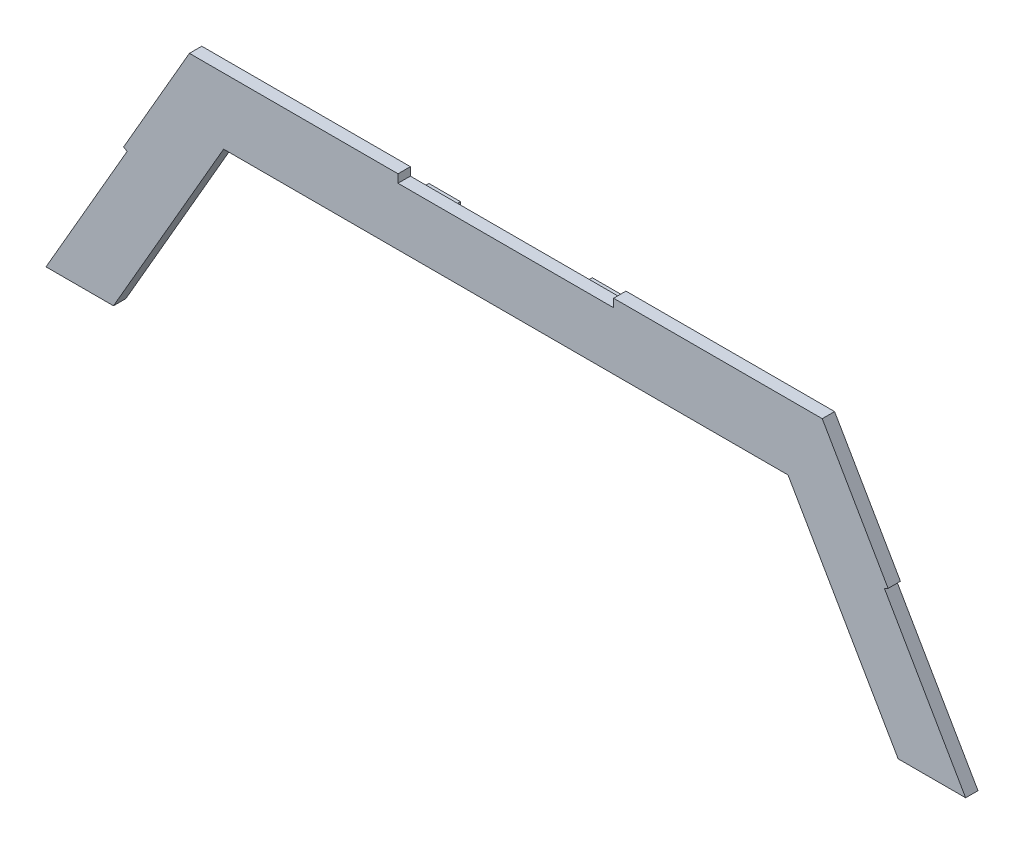
ISO-10303-21;
HEADER;
FILE_DESCRIPTION(('STEP AP214'),'2;1');
FILE_NAME('part.step','',(''),(''),'','','');
FILE_SCHEMA(('AUTOMOTIVE_DESIGN { 1 0 10303 214 1 1 1 1 }'));
ENDSEC;
DATA;
#1=APPLICATION_CONTEXT('core data for automotive mechanical design processes');
#2=APPLICATION_PROTOCOL_DEFINITION('international standard','automotive_design',2000,#1);
#3=PRODUCT_CONTEXT('',#1,'mechanical');
#4=PRODUCT('Part','Part','',(#3));
#5=PRODUCT_RELATED_PRODUCT_CATEGORY('part','',(#4));
#6=PRODUCT_DEFINITION_FORMATION('','',#4);
#7=PRODUCT_DEFINITION_CONTEXT('part definition',#1,'design');
#8=PRODUCT_DEFINITION('design','',#6,#7);
#9=PRODUCT_DEFINITION_SHAPE('','',#8);
#10=(LENGTH_UNIT() NAMED_UNIT(*) SI_UNIT(.MILLI.,.METRE.));
#11=(NAMED_UNIT(*) PLANE_ANGLE_UNIT() SI_UNIT($,.RADIAN.));
#12=(NAMED_UNIT(*) SI_UNIT($,.STERADIAN.) SOLID_ANGLE_UNIT());
#13=UNCERTAINTY_MEASURE_WITH_UNIT(LENGTH_MEASURE(1.E-05),#10,'distance_accuracy_value','');
#14=(GEOMETRIC_REPRESENTATION_CONTEXT(3) GLOBAL_UNCERTAINTY_ASSIGNED_CONTEXT((#13)) GLOBAL_UNIT_ASSIGNED_CONTEXT((#10,
#11,#12)) REPRESENTATION_CONTEXT('',''));
#15=CARTESIAN_POINT('',(0.,0.,0.));
#16=DIRECTION('',(0.,0.,1.));
#17=DIRECTION('',(1.,0.,0.));
#18=AXIS2_PLACEMENT_3D('',#15,#16,#17);
#19=CARTESIAN_POINT('',(0.,0.,0.));
#20=DIRECTION('',(0.,0.,-1.));
#21=DIRECTION('',(-1.,0.,0.));
#22=AXIS2_PLACEMENT_3D('',#19,#20,#21);
#23=PLANE('',#22);
#24=DIRECTION('',(-0.866025403784438,-0.500000000000002,0.));
#25=VECTOR('',#24,1.);
#26=CARTESIAN_POINT('',(146.072184671492,157.772179772718,0.));
#27=LINE('',#26,#25);
#28=CARTESIAN_POINT('',(147.447,158.565929772718,0.));
#29=VERTEX_POINT('',#28);
#30=CARTESIAN_POINT('',(146.072184671492,157.772179772718,0.));
#31=VERTEX_POINT('',#30);
#32=EDGE_CURVE('E274',#29,#31,#27,.T.);
#33=ORIENTED_EDGE('',*,*,#32,.T.);
#34=DIRECTION('',(0.5,-0.866025403784438,0.));
#35=VECTOR('',#34,1.);
#36=CARTESIAN_POINT('',(146.072184671492,157.772179772718,0.));
#37=LINE('',#36,#35);
#38=CARTESIAN_POINT('',(177.363912895323,103.573316632407,0.));
#39=VERTEX_POINT('',#38);
#40=EDGE_CURVE('E278',#31,#39,#37,.T.);
#41=ORIENTED_EDGE('',*,*,#40,.T.);
#42=DIRECTION('',(1.,0.,0.));
#43=VECTOR('',#42,1.);
#44=CARTESIAN_POINT('',(179.197,103.573316632407,0.));
#45=LINE('',#44,#43);
#46=CARTESIAN_POINT('',(151.334076008909,103.573316632407,0.));
#47=VERTEX_POINT('',#46);
#48=EDGE_CURVE('E381',#47,#39,#45,.T.);
#49=ORIENTED_EDGE('',*,*,#48,.F.);
#50=DIRECTION('',(0.5,-0.866025403784438,0.));
#51=VECTOR('',#50,1.);
#52=CARTESIAN_POINT('',(151.334076008909,103.573316632407,0.));
#53=LINE('',#52,#51);
#54=CARTESIAN_POINT('',(108.848772846325,177.160020284968,0.));
#55=VERTEX_POINT('',#54);
#56=EDGE_CURVE('E378',#55,#47,#53,.T.);
#57=ORIENTED_EDGE('',*,*,#56,.F.);
#58=DIRECTION('',(1.,0.,0.));
#59=VECTOR('',#58,1.);
#60=CARTESIAN_POINT('',(-108.848772846325,177.160020284968,0.));
#61=LINE('',#60,#59);
#62=CARTESIAN_POINT('',(-108.848772846325,177.160020284968,0.));
#63=VERTEX_POINT('',#62);
#64=EDGE_CURVE('E375',#63,#55,#61,.T.);
#65=ORIENTED_EDGE('',*,*,#64,.F.);
#66=DIRECTION('',(0.5,0.866025403784438,0.));
#67=VECTOR('',#66,1.);
#68=CARTESIAN_POINT('',(-151.334076008909,103.573316632407,0.));
#69=LINE('',#68,#67);
#70=CARTESIAN_POINT('',(-151.334076008909,103.573316632407,0.));
#71=VERTEX_POINT('',#70);
#72=EDGE_CURVE('E372',#71,#63,#69,.T.);
#73=ORIENTED_EDGE('',*,*,#72,.F.);
#74=DIRECTION('',(1.,0.,0.));
#75=VECTOR('',#74,1.);
#76=CARTESIAN_POINT('',(-179.197,103.573316632407,0.));
#77=LINE('',#76,#75);
#78=CARTESIAN_POINT('',(-177.363912895323,103.573316632407,0.));
#79=VERTEX_POINT('',#78);
#80=EDGE_CURVE('E369',#79,#71,#77,.T.);
#81=ORIENTED_EDGE('',*,*,#80,.F.);
#82=DIRECTION('',(-0.500000000000001,-0.866025403784438,0.));
#83=VECTOR('',#82,1.);
#84=CARTESIAN_POINT('',(-177.871496350429,102.694156299082,0.));
#85=LINE('',#84,#83);
#86=CARTESIAN_POINT('',(-146.072184671492,157.772179772718,0.));
#87=VERTEX_POINT('',#86);
#88=EDGE_CURVE('E11',#87,#79,#85,.T.);
#89=ORIENTED_EDGE('',*,*,#88,.F.);
#90=DIRECTION('',(-0.866025403784438,0.500000000000002,0.));
#91=VECTOR('',#90,1.);
#92=CARTESIAN_POINT('',(-146.072184671492,157.772179772718,0.));
#93=LINE('',#92,#91);
#94=CARTESIAN_POINT('',(-147.447,158.565929772718,0.));
#95=VERTEX_POINT('',#94);
#96=EDGE_CURVE('E297',#87,#95,#93,.T.);
#97=ORIENTED_EDGE('',*,*,#96,.T.);
#98=DIRECTION('',(-0.5,-0.866025403784439,0.));
#99=VECTOR('',#98,1.);
#100=CARTESIAN_POINT('',(-122.047,202.560020284968,0.));
#101=LINE('',#100,#99);
#102=CARTESIAN_POINT('',(-122.047,202.560020284968,0.));
#103=VERTEX_POINT('',#102);
#104=EDGE_CURVE('E365',#103,#95,#101,.T.);
#105=ORIENTED_EDGE('',*,*,#104,.F.);
#106=DIRECTION('',(-1.,0.,0.));
#107=VECTOR('',#106,1.);
#108=CARTESIAN_POINT('',(-122.047,202.560020284968,0.));
#109=LINE('',#108,#107);
#110=CARTESIAN_POINT('',(-41.5739478376422,202.560020284968,0.));
#111=VERTEX_POINT('',#110);
#112=EDGE_CURVE('E320',#111,#103,#109,.T.);
#113=ORIENTED_EDGE('',*,*,#112,.F.);
#114=DIRECTION('',(0.00553541378011569,0.999984679479782,0.));
#115=VECTOR('',#114,1.);
#116=CARTESIAN_POINT('',(-41.5739478376422,202.560020284968,0.));
#117=LINE('',#116,#115);
#118=CARTESIAN_POINT('',(-41.5915227763941,199.38506892762,0.));
#119=VERTEX_POINT('',#118);
#120=EDGE_CURVE('E326',#119,#111,#117,.T.);
#121=ORIENTED_EDGE('',*,*,#120,.F.);
#122=DIRECTION('',(-1.,0.,0.));
#123=VECTOR('',#122,1.);
#124=CARTESIAN_POINT('',(-41.5915227763941,199.38506892762,0.));
#125=LINE('',#124,#123);
#126=CARTESIAN_POINT('',(41.5915227763941,199.38506892762,0.));
#127=VERTEX_POINT('',#126);
#128=EDGE_CURVE('E394',#127,#119,#125,.T.);
#129=ORIENTED_EDGE('',*,*,#128,.F.);
#130=DIRECTION('',(0.00553541378011569,-0.999984679479782,0.));
#131=VECTOR('',#130,1.);
#132=CARTESIAN_POINT('',(41.5739478376422,202.560020284968,0.));
#133=LINE('',#132,#131);
#134=CARTESIAN_POINT('',(41.5739478376422,202.560020284968,0.));
#135=VERTEX_POINT('',#134);
#136=EDGE_CURVE('E391',#135,#127,#133,.T.);
#137=ORIENTED_EDGE('',*,*,#136,.F.);
#138=DIRECTION('',(-1.,0.,0.));
#139=VECTOR('',#138,1.);
#140=CARTESIAN_POINT('',(122.047,202.560020284968,0.));
#141=LINE('',#140,#139);
#142=CARTESIAN_POINT('',(122.047,202.560020284968,0.));
#143=VERTEX_POINT('',#142);
#144=EDGE_CURVE('E388',#143,#135,#141,.T.);
#145=ORIENTED_EDGE('',*,*,#144,.F.);
#146=DIRECTION('',(-0.5,0.866025403784439,0.));
#147=VECTOR('',#146,1.);
#148=CARTESIAN_POINT('',(122.047,202.560020284968,0.));
#149=LINE('',#148,#147);
#150=EDGE_CURVE('E385',#29,#143,#149,.T.);
#151=ORIENTED_EDGE('',*,*,#150,.F.);
#152=EDGE_LOOP('',(#33,#41,#49,#57,#65,#73,#81,#89,#97,#105,#113,#121,#129,#137,#145,#151));
#153=FACE_BOUND('',#152,.T.);
#154=DIRECTION('',(0.,-1.,0.));
#155=VECTOR('',#154,1.);
#156=CARTESIAN_POINT('',(37.592,197.35306892762,0.));
#157=LINE('',#156,#155);
#158=CARTESIAN_POINT('',(37.592,197.35306892762,0.));
#159=VERTEX_POINT('',#158);
#160=CARTESIAN_POINT('',(37.592,182.11306892762,0.));
#161=VERTEX_POINT('',#160);
#162=EDGE_CURVE('E234',#159,#161,#157,.T.);
#163=ORIENTED_EDGE('',*,*,#162,.F.);
#164=DIRECTION('',(1.,0.,0.));
#165=VECTOR('',#164,1.);
#166=CARTESIAN_POINT('',(25.4,197.35306892762,0.));
#167=LINE('',#166,#165);
#168=CARTESIAN_POINT('',(25.4,197.35306892762,0.));
#169=VERTEX_POINT('',#168);
#170=EDGE_CURVE('E229',#169,#159,#167,.T.);
#171=ORIENTED_EDGE('',*,*,#170,.F.);
#172=DIRECTION('',(0.,1.,0.));
#173=VECTOR('',#172,1.);
#174=CARTESIAN_POINT('',(25.4,182.11306892762,0.));
#175=LINE('',#174,#173);
#176=CARTESIAN_POINT('',(25.4,182.11306892762,0.));
#177=VERTEX_POINT('',#176);
#178=EDGE_CURVE('E244',#177,#169,#175,.T.);
#179=ORIENTED_EDGE('',*,*,#178,.F.);
#180=DIRECTION('',(-1.,0.,0.));
#181=VECTOR('',#180,1.);
#182=CARTESIAN_POINT('',(37.592,182.11306892762,0.));
#183=LINE('',#182,#181);
#184=EDGE_CURVE('E256',#161,#177,#183,.T.);
#185=ORIENTED_EDGE('',*,*,#184,.F.);
#186=EDGE_LOOP('',(#163,#171,#179,#185));
#187=FACE_BOUND('',#186,.T.);
#188=DIRECTION('',(0.,1.,0.));
#189=VECTOR('',#188,1.);
#190=CARTESIAN_POINT('',(-37.592,197.35306892762,0.));
#191=LINE('',#190,#189);
#192=CARTESIAN_POINT('',(-37.592,182.11306892762,0.));
#193=VERTEX_POINT('',#192);
#194=CARTESIAN_POINT('',(-37.592,197.35306892762,0.));
#195=VERTEX_POINT('',#194);
#196=EDGE_CURVE('E753',#193,#195,#191,.T.);
#197=ORIENTED_EDGE('',*,*,#196,.F.);
#198=DIRECTION('',(-1.,0.,0.));
#199=VECTOR('',#198,1.);
#200=CARTESIAN_POINT('',(-37.592,182.11306892762,0.));
#201=LINE('',#200,#199);
#202=CARTESIAN_POINT('',(-25.4,182.11306892762,0.));
#203=VERTEX_POINT('',#202);
#204=EDGE_CURVE('E226',#203,#193,#201,.T.);
#205=ORIENTED_EDGE('',*,*,#204,.F.);
#206=DIRECTION('',(0.,-1.,0.));
#207=VECTOR('',#206,1.);
#208=CARTESIAN_POINT('',(-25.4,182.11306892762,0.));
#209=LINE('',#208,#207);
#210=CARTESIAN_POINT('',(-25.4,197.35306892762,0.));
#211=VERTEX_POINT('',#210);
#212=EDGE_CURVE('E222',#211,#203,#209,.T.);
#213=ORIENTED_EDGE('',*,*,#212,.F.);
#214=DIRECTION('',(1.,0.,0.));
#215=VECTOR('',#214,1.);
#216=CARTESIAN_POINT('',(-25.4,197.35306892762,0.));
#217=LINE('',#216,#215);
#218=EDGE_CURVE('E749',#195,#211,#217,.T.);
#219=ORIENTED_EDGE('',*,*,#218,.F.);
#220=EDGE_LOOP('',(#197,#205,#213,#219));
#221=FACE_BOUND('',#220,.T.);
#222=ADVANCED_FACE('F39',(#153,#187,#221),#23,.T.);
#223=CARTESIAN_POINT('',(-122.047,202.560020284968,4.7625));
#224=DIRECTION('',(0.,-1.,0.));
#225=DIRECTION('',(0.,0.,-1.));
#226=AXIS2_PLACEMENT_3D('',#223,#224,#225);
#227=PLANE('',#226);
#228=ORIENTED_EDGE('',*,*,#112,.T.);
#229=DIRECTION('',(0.,0.,-1.));
#230=VECTOR('',#229,1.);
#231=CARTESIAN_POINT('',(-122.047,202.560020284968,4.7625));
#232=LINE('',#231,#230);
#233=CARTESIAN_POINT('',(-122.047,202.560020284968,4.7625));
#234=VERTEX_POINT('',#233);
#235=EDGE_CURVE('E48',#234,#103,#232,.T.);
#236=ORIENTED_EDGE('',*,*,#235,.F.);
#237=DIRECTION('',(-1.,0.,0.));
#238=VECTOR('',#237,1.);
#239=CARTESIAN_POINT('',(-122.047,202.560020284968,4.7625));
#240=LINE('',#239,#238);
#241=CARTESIAN_POINT('',(-41.5739478376422,202.560020284968,4.7625));
#242=VERTEX_POINT('',#241);
#243=EDGE_CURVE('E321',#242,#234,#240,.T.);
#244=ORIENTED_EDGE('',*,*,#243,.F.);
#245=DIRECTION('',(0.,0.,-1.));
#246=VECTOR('',#245,1.);
#247=CARTESIAN_POINT('',(-41.5739478376422,202.560020284968,4.7625));
#248=LINE('',#247,#246);
#249=EDGE_CURVE('E361',#242,#111,#248,.T.);
#250=ORIENTED_EDGE('',*,*,#249,.T.);
#251=EDGE_LOOP('',(#228,#236,#244,#250));
#252=FACE_BOUND('',#251,.T.);
#253=ADVANCED_FACE('F41',(#252),#227,.F.);
#254=CARTESIAN_POINT('',(-122.047,202.560020284968,4.7625));
#255=DIRECTION('',(0.866025403784439,-0.5,0.));
#256=DIRECTION('',(0.5,0.866025403784439,0.));
#257=AXIS2_PLACEMENT_3D('',#254,#255,#256);
#258=PLANE('',#257);
#259=ORIENTED_EDGE('',*,*,#104,.T.);
#260=DIRECTION('',(0.,0.,1.));
#261=VECTOR('',#260,1.);
#262=CARTESIAN_POINT('',(-147.447,158.565929772718,0.));
#263=LINE('',#262,#261);
#264=CARTESIAN_POINT('',(-147.447,158.565929772718,4.7625));
#265=VERTEX_POINT('',#264);
#266=EDGE_CURVE('E288',#95,#265,#263,.T.);
#267=ORIENTED_EDGE('',*,*,#266,.T.);
#268=DIRECTION('',(-0.5,-0.866025403784439,0.));
#269=VECTOR('',#268,1.);
#270=CARTESIAN_POINT('',(-122.047,202.560020284968,4.7625));
#271=LINE('',#270,#269);
#272=EDGE_CURVE('E325',#234,#265,#271,.T.);
#273=ORIENTED_EDGE('',*,*,#272,.F.);
#274=ORIENTED_EDGE('',*,*,#235,.T.);
#275=EDGE_LOOP('',(#259,#267,#273,#274));
#276=FACE_BOUND('',#275,.T.);
#277=ADVANCED_FACE('F437',(#276),#258,.F.);
#278=CARTESIAN_POINT('',(-179.197,103.573316632407,4.7625));
#279=DIRECTION('',(0.,1.,0.));
#280=DIRECTION('',(0.,0.,1.));
#281=AXIS2_PLACEMENT_3D('',#278,#279,#280);
#282=PLANE('',#281);
#283=DIRECTION('',(1.,0.,0.));
#284=VECTOR('',#283,1.);
#285=CARTESIAN_POINT('',(-179.197,103.573316632407,4.7625));
#286=LINE('',#285,#284);
#287=CARTESIAN_POINT('',(-177.363912895323,103.573316632407,4.7625));
#288=VERTEX_POINT('',#287);
#289=CARTESIAN_POINT('',(-151.334076008909,103.573316632407,4.7625));
#290=VERTEX_POINT('',#289);
#291=EDGE_CURVE('E330',#288,#290,#286,.T.);
#292=ORIENTED_EDGE('',*,*,#291,.F.);
#293=DIRECTION('',(0.,0.,-1.));
#294=VECTOR('',#293,1.);
#295=CARTESIAN_POINT('',(-177.363912895323,103.573316632407,4.7625));
#296=LINE('',#295,#294);
#297=EDGE_CURVE('E294',#288,#79,#296,.T.);
#298=ORIENTED_EDGE('',*,*,#297,.T.);
#299=ORIENTED_EDGE('',*,*,#80,.T.);
#300=DIRECTION('',(0.,0.,-1.));
#301=VECTOR('',#300,1.);
#302=CARTESIAN_POINT('',(-151.334076008909,103.573316632407,4.7625));
#303=LINE('',#302,#301);
#304=EDGE_CURVE('E430',#290,#71,#303,.T.);
#305=ORIENTED_EDGE('',*,*,#304,.F.);
#306=EDGE_LOOP('',(#292,#298,#299,#305));
#307=FACE_BOUND('',#306,.T.);
#308=ADVANCED_FACE('F461',(#307),#282,.F.);
#309=CARTESIAN_POINT('',(-151.334076008909,103.573316632407,4.7625));
#310=DIRECTION('',(-0.866025403784438,0.5,0.));
#311=DIRECTION('',(-0.5,-0.866025403784438,0.));
#312=AXIS2_PLACEMENT_3D('',#309,#310,#311);
#313=PLANE('',#312);
#314=ORIENTED_EDGE('',*,*,#72,.T.);
#315=DIRECTION('',(0.,0.,-1.));
#316=VECTOR('',#315,1.);
#317=CARTESIAN_POINT('',(-108.848772846325,177.160020284968,4.7625));
#318=LINE('',#317,#316);
#319=CARTESIAN_POINT('',(-108.848772846325,177.160020284968,4.7625));
#320=VERTEX_POINT('',#319);
#321=EDGE_CURVE('E426',#320,#63,#318,.T.);
#322=ORIENTED_EDGE('',*,*,#321,.F.);
#323=DIRECTION('',(0.5,0.866025403784438,0.));
#324=VECTOR('',#323,1.);
#325=CARTESIAN_POINT('',(-151.334076008909,103.573316632407,4.7625));
#326=LINE('',#325,#324);
#327=EDGE_CURVE('E333',#290,#320,#326,.T.);
#328=ORIENTED_EDGE('',*,*,#327,.F.);
#329=ORIENTED_EDGE('',*,*,#304,.T.);
#330=EDGE_LOOP('',(#314,#322,#328,#329));
#331=FACE_BOUND('',#330,.T.);
#332=ADVANCED_FACE('F466',(#331),#313,.F.);
#333=CARTESIAN_POINT('',(-108.848772846325,177.160020284968,4.7625));
#334=DIRECTION('',(0.,1.,0.));
#335=DIRECTION('',(0.,0.,1.));
#336=AXIS2_PLACEMENT_3D('',#333,#334,#335);
#337=PLANE('',#336);
#338=ORIENTED_EDGE('',*,*,#64,.T.);
#339=DIRECTION('',(0.,0.,-1.));
#340=VECTOR('',#339,1.);
#341=CARTESIAN_POINT('',(108.848772846325,177.160020284968,4.7625));
#342=LINE('',#341,#340);
#343=CARTESIAN_POINT('',(108.848772846325,177.160020284968,4.7625));
#344=VERTEX_POINT('',#343);
#345=EDGE_CURVE('E422',#344,#55,#342,.T.);
#346=ORIENTED_EDGE('',*,*,#345,.F.);
#347=DIRECTION('',(1.,0.,0.));
#348=VECTOR('',#347,1.);
#349=CARTESIAN_POINT('',(-108.848772846325,177.160020284968,4.7625));
#350=LINE('',#349,#348);
#351=EDGE_CURVE('E336',#320,#344,#350,.T.);
#352=ORIENTED_EDGE('',*,*,#351,.F.);
#353=ORIENTED_EDGE('',*,*,#321,.T.);
#354=EDGE_LOOP('',(#338,#346,#352,#353));
#355=FACE_BOUND('',#354,.T.);
#356=ADVANCED_FACE('F472',(#355),#337,.F.);
#357=CARTESIAN_POINT('',(151.334076008909,103.573316632407,4.7625));
#358=DIRECTION('',(0.866025403784438,0.5,0.));
#359=DIRECTION('',(-0.5,0.866025403784438,0.));
#360=AXIS2_PLACEMENT_3D('',#357,#358,#359);
#361=PLANE('',#360);
#362=ORIENTED_EDGE('',*,*,#56,.T.);
#363=DIRECTION('',(0.,0.,-1.));
#364=VECTOR('',#363,1.);
#365=CARTESIAN_POINT('',(151.334076008909,103.573316632407,4.7625));
#366=LINE('',#365,#364);
#367=CARTESIAN_POINT('',(151.334076008909,103.573316632407,4.7625));
#368=VERTEX_POINT('',#367);
#369=EDGE_CURVE('E418',#368,#47,#366,.T.);
#370=ORIENTED_EDGE('',*,*,#369,.F.);
#371=DIRECTION('',(0.5,-0.866025403784438,0.));
#372=VECTOR('',#371,1.);
#373=CARTESIAN_POINT('',(151.334076008909,103.573316632407,4.7625));
#374=LINE('',#373,#372);
#375=EDGE_CURVE('E339',#344,#368,#374,.T.);
#376=ORIENTED_EDGE('',*,*,#375,.F.);
#377=ORIENTED_EDGE('',*,*,#345,.T.);
#378=EDGE_LOOP('',(#362,#370,#376,#377));
#379=FACE_BOUND('',#378,.T.);
#380=ADVANCED_FACE('F476',(#379),#361,.F.);
#381=CARTESIAN_POINT('',(179.197,103.573316632407,4.7625));
#382=DIRECTION('',(0.,1.,0.));
#383=DIRECTION('',(0.,0.,1.));
#384=AXIS2_PLACEMENT_3D('',#381,#382,#383);
#385=PLANE('',#384);
#386=ORIENTED_EDGE('',*,*,#48,.T.);
#387=DIRECTION('',(0.,0.,1.));
#388=VECTOR('',#387,1.);
#389=CARTESIAN_POINT('',(177.363912895323,103.573316632407,4.7625));
#390=LINE('',#389,#388);
#391=CARTESIAN_POINT('',(177.363912895323,103.573316632407,4.7625));
#392=VERTEX_POINT('',#391);
#393=EDGE_CURVE('E316',#39,#392,#390,.T.);
#394=ORIENTED_EDGE('',*,*,#393,.T.);
#395=DIRECTION('',(1.,0.,0.));
#396=VECTOR('',#395,1.);
#397=CARTESIAN_POINT('',(179.197,103.573316632407,4.7625));
#398=LINE('',#397,#396);
#399=EDGE_CURVE('E342',#368,#392,#398,.T.);
#400=ORIENTED_EDGE('',*,*,#399,.F.);
#401=ORIENTED_EDGE('',*,*,#369,.T.);
#402=EDGE_LOOP('',(#386,#394,#400,#401));
#403=FACE_BOUND('',#402,.T.);
#404=ADVANCED_FACE('F480',(#403),#385,.F.);
#405=CARTESIAN_POINT('',(122.047,202.560020284968,4.7625));
#406=DIRECTION('',(-0.866025403784439,-0.5,0.));
#407=DIRECTION('',(0.5,-0.866025403784439,0.));
#408=AXIS2_PLACEMENT_3D('',#405,#406,#407);
#409=PLANE('',#408);
#410=DIRECTION('',(-0.5,0.866025403784439,0.));
#411=VECTOR('',#410,1.);
#412=CARTESIAN_POINT('',(122.047,202.560020284968,4.7625));
#413=LINE('',#412,#411);
#414=CARTESIAN_POINT('',(147.447,158.565929772718,4.7625));
#415=VERTEX_POINT('',#414);
#416=CARTESIAN_POINT('',(122.047,202.560020284968,4.7625));
#417=VERTEX_POINT('',#416);
#418=EDGE_CURVE('E346',#415,#417,#413,.T.);
#419=ORIENTED_EDGE('',*,*,#418,.F.);
#420=DIRECTION('',(0.,0.,1.));
#421=VECTOR('',#420,1.);
#422=CARTESIAN_POINT('',(147.447,158.565929772718,0.));
#423=LINE('',#422,#421);
#424=EDGE_CURVE('E291',#29,#415,#423,.T.);
#425=ORIENTED_EDGE('',*,*,#424,.F.);
#426=ORIENTED_EDGE('',*,*,#150,.T.);
#427=DIRECTION('',(0.,0.,-1.));
#428=VECTOR('',#427,1.);
#429=CARTESIAN_POINT('',(122.047,202.560020284968,4.7625));
#430=LINE('',#429,#428);
#431=EDGE_CURVE('E414',#417,#143,#430,.T.);
#432=ORIENTED_EDGE('',*,*,#431,.F.);
#433=EDGE_LOOP('',(#419,#425,#426,#432));
#434=FACE_BOUND('',#433,.T.);
#435=ADVANCED_FACE('F491',(#434),#409,.F.);
#436=CARTESIAN_POINT('',(122.047,202.560020284968,4.7625));
#437=DIRECTION('',(0.,-1.,0.));
#438=DIRECTION('',(0.,0.,-1.));
#439=AXIS2_PLACEMENT_3D('',#436,#437,#438);
#440=PLANE('',#439);
#441=ORIENTED_EDGE('',*,*,#144,.T.);
#442=DIRECTION('',(0.,0.,-1.));
#443=VECTOR('',#442,1.);
#444=CARTESIAN_POINT('',(41.5739478376422,202.560020284968,4.7625));
#445=LINE('',#444,#443);
#446=CARTESIAN_POINT('',(41.5739478376422,202.560020284968,4.7625));
#447=VERTEX_POINT('',#446);
#448=EDGE_CURVE('E410',#447,#135,#445,.T.);
#449=ORIENTED_EDGE('',*,*,#448,.F.);
#450=DIRECTION('',(-1.,0.,0.));
#451=VECTOR('',#450,1.);
#452=CARTESIAN_POINT('',(122.047,202.560020284968,4.7625));
#453=LINE('',#452,#451);
#454=EDGE_CURVE('E349',#417,#447,#453,.T.);
#455=ORIENTED_EDGE('',*,*,#454,.F.);
#456=ORIENTED_EDGE('',*,*,#431,.T.);
#457=EDGE_LOOP('',(#441,#449,#455,#456));
#458=FACE_BOUND('',#457,.T.);
#459=ADVANCED_FACE('F497',(#458),#440,.F.);
#460=CARTESIAN_POINT('',(41.5739478376422,202.560020284968,4.7625));
#461=DIRECTION('',(0.999984679479782,0.00553541378011569,0.));
#462=DIRECTION('',(-0.0055354137801157,0.999984679479782,0.));
#463=AXIS2_PLACEMENT_3D('',#460,#461,#462);
#464=PLANE('',#463);
#465=ORIENTED_EDGE('',*,*,#136,.T.);
#466=DIRECTION('',(0.,0.,-1.));
#467=VECTOR('',#466,1.);
#468=CARTESIAN_POINT('',(41.5915227763941,199.38506892762,4.7625));
#469=LINE('',#468,#467);
#470=CARTESIAN_POINT('',(41.5915227763941,199.38506892762,4.7625));
#471=VERTEX_POINT('',#470);
#472=EDGE_CURVE('E406',#471,#127,#469,.T.);
#473=ORIENTED_EDGE('',*,*,#472,.F.);
#474=DIRECTION('',(0.00553541378011569,-0.999984679479782,0.));
#475=VECTOR('',#474,1.);
#476=CARTESIAN_POINT('',(41.5739478376422,202.560020284968,4.7625));
#477=LINE('',#476,#475);
#478=EDGE_CURVE('E352',#447,#471,#477,.T.);
#479=ORIENTED_EDGE('',*,*,#478,.F.);
#480=ORIENTED_EDGE('',*,*,#448,.T.);
#481=EDGE_LOOP('',(#465,#473,#479,#480));
#482=FACE_BOUND('',#481,.T.);
#483=ADVANCED_FACE('F501',(#482),#464,.F.);
#484=CARTESIAN_POINT('',(-41.5915227763941,199.38506892762,4.7625));
#485=DIRECTION('',(0.,-1.,0.));
#486=DIRECTION('',(0.,0.,-1.));
#487=AXIS2_PLACEMENT_3D('',#484,#485,#486);
#488=PLANE('',#487);
#489=ORIENTED_EDGE('',*,*,#128,.T.);
#490=DIRECTION('',(0.,0.,-1.));
#491=VECTOR('',#490,1.);
#492=CARTESIAN_POINT('',(-41.5915227763941,199.38506892762,4.7625));
#493=LINE('',#492,#491);
#494=CARTESIAN_POINT('',(-41.5915227763941,199.38506892762,4.7625));
#495=VERTEX_POINT('',#494);
#496=EDGE_CURVE('E402',#495,#119,#493,.T.);
#497=ORIENTED_EDGE('',*,*,#496,.F.);
#498=DIRECTION('',(-1.,0.,0.));
#499=VECTOR('',#498,1.);
#500=CARTESIAN_POINT('',(-41.5915227763941,199.38506892762,4.7625));
#501=LINE('',#500,#499);
#502=EDGE_CURVE('E355',#471,#495,#501,.T.);
#503=ORIENTED_EDGE('',*,*,#502,.F.);
#504=ORIENTED_EDGE('',*,*,#472,.T.);
#505=EDGE_LOOP('',(#489,#497,#503,#504));
#506=FACE_BOUND('',#505,.T.);
#507=ADVANCED_FACE('F507',(#506),#488,.F.);
#508=CARTESIAN_POINT('',(-41.5739478376422,202.560020284968,4.7625));
#509=DIRECTION('',(-0.999984679479782,0.00553541378011569,0.));
#510=DIRECTION('',(-0.0055354137801157,-0.999984679479782,0.));
#511=AXIS2_PLACEMENT_3D('',#508,#509,#510);
#512=PLANE('',#511);
#513=ORIENTED_EDGE('',*,*,#120,.T.);
#514=ORIENTED_EDGE('',*,*,#249,.F.);
#515=DIRECTION('',(0.00553541378011569,0.999984679479782,0.));
#516=VECTOR('',#515,1.);
#517=CARTESIAN_POINT('',(-41.5739478376422,202.560020284968,4.7625));
#518=LINE('',#517,#516);
#519=EDGE_CURVE('E358',#495,#242,#518,.T.);
#520=ORIENTED_EDGE('',*,*,#519,.F.);
#521=ORIENTED_EDGE('',*,*,#496,.T.);
#522=EDGE_LOOP('',(#513,#514,#520,#521));
#523=FACE_BOUND('',#522,.T.);
#524=ADVANCED_FACE('F509',(#523),#512,.F.);
#525=CARTESIAN_POINT('',(0.,0.,4.7625));
#526=DIRECTION('',(0.,0.,-1.));
#527=DIRECTION('',(-1.,0.,0.));
#528=AXIS2_PLACEMENT_3D('',#525,#526,#527);
#529=PLANE('',#528);
#530=DIRECTION('',(0.5,-0.866025403784438,0.));
#531=VECTOR('',#530,1.);
#532=CARTESIAN_POINT('',(146.072184671492,157.772179772718,4.7625));
#533=LINE('',#532,#531);
#534=CARTESIAN_POINT('',(146.072184671492,157.772179772718,4.7625));
#535=VERTEX_POINT('',#534);
#536=EDGE_CURVE('E279',#535,#392,#533,.T.);
#537=ORIENTED_EDGE('',*,*,#536,.F.);
#538=DIRECTION('',(-0.866025403784438,-0.500000000000002,0.));
#539=VECTOR('',#538,1.);
#540=CARTESIAN_POINT('',(146.072184671492,157.772179772718,4.7625));
#541=LINE('',#540,#539);
#542=EDGE_CURVE('E284',#415,#535,#541,.T.);
#543=ORIENTED_EDGE('',*,*,#542,.F.);
#544=ORIENTED_EDGE('',*,*,#418,.T.);
#545=ORIENTED_EDGE('',*,*,#454,.T.);
#546=ORIENTED_EDGE('',*,*,#478,.T.);
#547=ORIENTED_EDGE('',*,*,#502,.T.);
#548=ORIENTED_EDGE('',*,*,#519,.T.);
#549=ORIENTED_EDGE('',*,*,#243,.T.);
#550=ORIENTED_EDGE('',*,*,#272,.T.);
#551=DIRECTION('',(-0.866025403784438,0.500000000000002,0.));
#552=VECTOR('',#551,1.);
#553=CARTESIAN_POINT('',(-146.072184671492,157.772179772718,4.7625));
#554=LINE('',#553,#552);
#555=CARTESIAN_POINT('',(-146.072184671492,157.772179772718,4.7625));
#556=VERTEX_POINT('',#555);
#557=EDGE_CURVE('E302',#556,#265,#554,.T.);
#558=ORIENTED_EDGE('',*,*,#557,.F.);
#559=DIRECTION('',(0.5,0.866025403784438,0.));
#560=VECTOR('',#559,1.);
#561=CARTESIAN_POINT('',(-146.072184671492,157.772179772718,4.7625));
#562=LINE('',#561,#560);
#563=EDGE_CURVE('E273',#288,#556,#562,.T.);
#564=ORIENTED_EDGE('',*,*,#563,.F.);
#565=ORIENTED_EDGE('',*,*,#291,.T.);
#566=ORIENTED_EDGE('',*,*,#327,.T.);
#567=ORIENTED_EDGE('',*,*,#351,.T.);
#568=ORIENTED_EDGE('',*,*,#375,.T.);
#569=ORIENTED_EDGE('',*,*,#399,.T.);
#570=EDGE_LOOP('',(#537,#543,#544,#545,#546,#547,#548,#549,#550,#558,#564,#565,#566,#567,#568,#569));
#571=FACE_BOUND('',#570,.T.);
#572=ADVANCED_FACE('F458',(#571),#529,.F.);
#573=CARTESIAN_POINT('',(-146.072184671492,157.772179772718,0.));
#574=DIRECTION('',(0.866025403784438,-0.500000000000001,0.));
#575=DIRECTION('',(0.500000000000001,0.866025403784438,0.));
#576=AXIS2_PLACEMENT_3D('',#573,#574,#575);
#577=PLANE('',#576);
#578=ORIENTED_EDGE('',*,*,#563,.T.);
#579=DIRECTION('',(0.,0.,1.));
#580=VECTOR('',#579,1.);
#581=CARTESIAN_POINT('',(-146.072184671492,157.772179772718,0.));
#582=LINE('',#581,#580);
#583=EDGE_CURVE('E301',#87,#556,#582,.T.);
#584=ORIENTED_EDGE('',*,*,#583,.F.);
#585=ORIENTED_EDGE('',*,*,#88,.T.);
#586=ORIENTED_EDGE('',*,*,#297,.F.);
#587=EDGE_LOOP('',(#578,#584,#585,#586));
#588=FACE_BOUND('',#587,.T.);
#589=ADVANCED_FACE('F453',(#588),#577,.F.);
#590=CARTESIAN_POINT('',(-146.072184671492,157.772179772718,0.));
#591=DIRECTION('',(0.500000000000002,0.866025403784437,0.));
#592=DIRECTION('',(-0.866025403784437,0.500000000000002,0.));
#593=AXIS2_PLACEMENT_3D('',#590,#591,#592);
#594=PLANE('',#593);
#595=ORIENTED_EDGE('',*,*,#557,.T.);
#596=ORIENTED_EDGE('',*,*,#266,.F.);
#597=ORIENTED_EDGE('',*,*,#96,.F.);
#598=ORIENTED_EDGE('',*,*,#583,.T.);
#599=EDGE_LOOP('',(#595,#596,#597,#598));
#600=FACE_BOUND('',#599,.T.);
#601=ADVANCED_FACE('F450',(#600),#594,.F.);
#602=CARTESIAN_POINT('',(146.072184671492,157.772179772718,0.));
#603=DIRECTION('',(-0.866025403784438,-0.500000000000001,0.));
#604=DIRECTION('',(0.500000000000001,-0.866025403784438,0.));
#605=AXIS2_PLACEMENT_3D('',#602,#603,#604);
#606=PLANE('',#605);
#607=ORIENTED_EDGE('',*,*,#40,.F.);
#608=DIRECTION('',(0.,0.,1.));
#609=VECTOR('',#608,1.);
#610=CARTESIAN_POINT('',(146.072184671492,157.772179772718,0.));
#611=LINE('',#610,#609);
#612=EDGE_CURVE('E283',#31,#535,#611,.T.);
#613=ORIENTED_EDGE('',*,*,#612,.T.);
#614=ORIENTED_EDGE('',*,*,#536,.T.);
#615=ORIENTED_EDGE('',*,*,#393,.F.);
#616=EDGE_LOOP('',(#607,#613,#614,#615));
#617=FACE_BOUND('',#616,.T.);
#618=ADVANCED_FACE('F485',(#617),#606,.F.);
#619=CARTESIAN_POINT('',(146.072184671492,157.772179772718,0.));
#620=DIRECTION('',(-0.500000000000002,0.866025403784437,0.));
#621=DIRECTION('',(-0.866025403784437,-0.500000000000002,0.));
#622=AXIS2_PLACEMENT_3D('',#619,#620,#621);
#623=PLANE('',#622);
#624=ORIENTED_EDGE('',*,*,#542,.T.);
#625=ORIENTED_EDGE('',*,*,#612,.F.);
#626=ORIENTED_EDGE('',*,*,#32,.F.);
#627=ORIENTED_EDGE('',*,*,#424,.T.);
#628=EDGE_LOOP('',(#624,#625,#626,#627));
#629=FACE_BOUND('',#628,.T.);
#630=ADVANCED_FACE('F487',(#629),#623,.F.);
#631=CARTESIAN_POINT('',(25.4,197.35306892762,-3.175));
#632=DIRECTION('',(0.,-1.,0.));
#633=DIRECTION('',(0.,0.,-1.));
#634=AXIS2_PLACEMENT_3D('',#631,#632,#633);
#635=PLANE('',#634);
#636=ORIENTED_EDGE('',*,*,#170,.T.);
#637=DIRECTION('',(0.,0.,1.));
#638=VECTOR('',#637,1.);
#639=CARTESIAN_POINT('',(37.592,197.35306892762,-3.175));
#640=LINE('',#639,#638);
#641=CARTESIAN_POINT('',(37.592,197.35306892762,-3.175));
#642=VERTEX_POINT('',#641);
#643=EDGE_CURVE('E270',#642,#159,#640,.T.);
#644=ORIENTED_EDGE('',*,*,#643,.F.);
#645=DIRECTION('',(1.,0.,0.));
#646=VECTOR('',#645,1.);
#647=CARTESIAN_POINT('',(25.4,197.35306892762,-3.175));
#648=LINE('',#647,#646);
#649=CARTESIAN_POINT('',(25.4,197.35306892762,-3.175));
#650=VERTEX_POINT('',#649);
#651=EDGE_CURVE('E239',#650,#642,#648,.T.);
#652=ORIENTED_EDGE('',*,*,#651,.F.);
#653=DIRECTION('',(0.,0.,1.));
#654=VECTOR('',#653,1.);
#655=CARTESIAN_POINT('',(25.4,197.35306892762,-3.175));
#656=LINE('',#655,#654);
#657=EDGE_CURVE('E252',#650,#169,#656,.T.);
#658=ORIENTED_EDGE('',*,*,#657,.T.);
#659=EDGE_LOOP('',(#636,#644,#652,#658));
#660=FACE_BOUND('',#659,.T.);
#661=ADVANCED_FACE('F530',(#660),#635,.F.);
#662=CARTESIAN_POINT('',(37.592,197.35306892762,-3.175));
#663=DIRECTION('',(-1.,0.,0.));
#664=DIRECTION('',(0.,-1.,0.));
#665=AXIS2_PLACEMENT_3D('',#662,#663,#664);
#666=PLANE('',#665);
#667=ORIENTED_EDGE('',*,*,#162,.T.);
#668=DIRECTION('',(0.,0.,1.));
#669=VECTOR('',#668,1.);
#670=CARTESIAN_POINT('',(37.592,182.11306892762,-3.175));
#671=LINE('',#670,#669);
#672=CARTESIAN_POINT('',(37.592,182.11306892762,-3.175));
#673=VERTEX_POINT('',#672);
#674=EDGE_CURVE('E266',#673,#161,#671,.T.);
#675=ORIENTED_EDGE('',*,*,#674,.F.);
#676=DIRECTION('',(0.,-1.,0.));
#677=VECTOR('',#676,1.);
#678=CARTESIAN_POINT('',(37.592,197.35306892762,-3.175));
#679=LINE('',#678,#677);
#680=EDGE_CURVE('E243',#642,#673,#679,.T.);
#681=ORIENTED_EDGE('',*,*,#680,.F.);
#682=ORIENTED_EDGE('',*,*,#643,.T.);
#683=EDGE_LOOP('',(#667,#675,#681,#682));
#684=FACE_BOUND('',#683,.T.);
#685=ADVANCED_FACE('F535',(#684),#666,.F.);
#686=CARTESIAN_POINT('',(37.592,182.11306892762,-3.175));
#687=DIRECTION('',(0.,1.,0.));
#688=DIRECTION('',(0.,0.,1.));
#689=AXIS2_PLACEMENT_3D('',#686,#687,#688);
#690=PLANE('',#689);
#691=ORIENTED_EDGE('',*,*,#184,.T.);
#692=DIRECTION('',(0.,0.,1.));
#693=VECTOR('',#692,1.);
#694=CARTESIAN_POINT('',(25.4,182.11306892762,-3.175));
#695=LINE('',#694,#693);
#696=CARTESIAN_POINT('',(25.4,182.11306892762,-3.175));
#697=VERTEX_POINT('',#696);
#698=EDGE_CURVE('E63',#697,#177,#695,.T.);
#699=ORIENTED_EDGE('',*,*,#698,.F.);
#700=DIRECTION('',(-1.,0.,0.));
#701=VECTOR('',#700,1.);
#702=CARTESIAN_POINT('',(37.592,182.11306892762,-3.175));
#703=LINE('',#702,#701);
#704=EDGE_CURVE('E247',#673,#697,#703,.T.);
#705=ORIENTED_EDGE('',*,*,#704,.F.);
#706=ORIENTED_EDGE('',*,*,#674,.T.);
#707=EDGE_LOOP('',(#691,#699,#705,#706));
#708=FACE_BOUND('',#707,.T.);
#709=ADVANCED_FACE('F539',(#708),#690,.F.);
#710=CARTESIAN_POINT('',(25.4,182.11306892762,-3.175));
#711=DIRECTION('',(1.,0.,0.));
#712=DIRECTION('',(0.,1.,0.));
#713=AXIS2_PLACEMENT_3D('',#710,#711,#712);
#714=PLANE('',#713);
#715=ORIENTED_EDGE('',*,*,#178,.T.);
#716=ORIENTED_EDGE('',*,*,#657,.F.);
#717=DIRECTION('',(0.,1.,0.));
#718=VECTOR('',#717,1.);
#719=CARTESIAN_POINT('',(25.4,182.11306892762,-3.175));
#720=LINE('',#719,#718);
#721=EDGE_CURVE('E250',#697,#650,#720,.T.);
#722=ORIENTED_EDGE('',*,*,#721,.F.);
#723=ORIENTED_EDGE('',*,*,#698,.T.);
#724=EDGE_LOOP('',(#715,#716,#722,#723));
#725=FACE_BOUND('',#724,.T.);
#726=ADVANCED_FACE('F543',(#725),#714,.F.);
#727=CARTESIAN_POINT('',(0.,0.,-3.175));
#728=DIRECTION('',(0.,0.,-1.));
#729=DIRECTION('',(-1.,0.,0.));
#730=AXIS2_PLACEMENT_3D('',#727,#728,#729);
#731=PLANE('',#730);
#732=ORIENTED_EDGE('',*,*,#651,.T.);
#733=ORIENTED_EDGE('',*,*,#680,.T.);
#734=ORIENTED_EDGE('',*,*,#704,.T.);
#735=ORIENTED_EDGE('',*,*,#721,.T.);
#736=EDGE_LOOP('',(#732,#733,#734,#735));
#737=FACE_BOUND('',#736,.T.);
#738=ADVANCED_FACE('F547',(#737),#731,.T.);
#739=CARTESIAN_POINT('',(-37.592,182.11306892762,-3.175));
#740=DIRECTION('',(0.,1.,0.));
#741=DIRECTION('',(0.,0.,1.));
#742=AXIS2_PLACEMENT_3D('',#739,#740,#741);
#743=PLANE('',#742);
#744=ORIENTED_EDGE('',*,*,#204,.T.);
#745=DIRECTION('',(0.,0.,1.));
#746=VECTOR('',#745,1.);
#747=CARTESIAN_POINT('',(-37.592,182.11306892762,-3.175));
#748=LINE('',#747,#746);
#749=CARTESIAN_POINT('',(-37.592,182.11306892762,-3.175));
#750=VERTEX_POINT('',#749);
#751=EDGE_CURVE('E205',#750,#193,#748,.T.);
#752=ORIENTED_EDGE('',*,*,#751,.F.);
#753=DIRECTION('',(-1.,0.,0.));
#754=VECTOR('',#753,1.);
#755=CARTESIAN_POINT('',(-37.592,182.11306892762,-3.175));
#756=LINE('',#755,#754);
#757=CARTESIAN_POINT('',(-25.4,182.11306892762,-3.175));
#758=VERTEX_POINT('',#757);
#759=EDGE_CURVE('E213',#758,#750,#756,.T.);
#760=ORIENTED_EDGE('',*,*,#759,.F.);
#761=DIRECTION('',(0.,0.,1.));
#762=VECTOR('',#761,1.);
#763=CARTESIAN_POINT('',(-25.4,182.11306892762,-3.175));
#764=LINE('',#763,#762);
#765=EDGE_CURVE('E745',#758,#203,#764,.T.);
#766=ORIENTED_EDGE('',*,*,#765,.T.);
#767=EDGE_LOOP('',(#744,#752,#760,#766));
#768=FACE_BOUND('',#767,.T.);
#769=ADVANCED_FACE('F224',(#768),#743,.F.);
#770=CARTESIAN_POINT('',(-37.592,197.35306892762,-3.175));
#771=DIRECTION('',(1.,0.,0.));
#772=DIRECTION('',(0.,1.,0.));
#773=AXIS2_PLACEMENT_3D('',#770,#771,#772);
#774=PLANE('',#773);
#775=ORIENTED_EDGE('',*,*,#196,.T.);
#776=DIRECTION('',(0.,0.,1.));
#777=VECTOR('',#776,1.);
#778=CARTESIAN_POINT('',(-37.592,197.35306892762,-3.175));
#779=LINE('',#778,#777);
#780=CARTESIAN_POINT('',(-37.592,197.35306892762,-3.175));
#781=VERTEX_POINT('',#780);
#782=EDGE_CURVE('E208',#781,#195,#779,.T.);
#783=ORIENTED_EDGE('',*,*,#782,.F.);
#784=DIRECTION('',(0.,1.,0.));
#785=VECTOR('',#784,1.);
#786=CARTESIAN_POINT('',(-37.592,197.35306892762,-3.175));
#787=LINE('',#786,#785);
#788=EDGE_CURVE('E201',#750,#781,#787,.T.);
#789=ORIENTED_EDGE('',*,*,#788,.F.);
#790=ORIENTED_EDGE('',*,*,#751,.T.);
#791=EDGE_LOOP('',(#775,#783,#789,#790));
#792=FACE_BOUND('',#791,.T.);
#793=ADVANCED_FACE('F203',(#792),#774,.F.);
#794=CARTESIAN_POINT('',(-25.4,197.35306892762,-3.175));
#795=DIRECTION('',(0.,-1.,0.));
#796=DIRECTION('',(0.,0.,-1.));
#797=AXIS2_PLACEMENT_3D('',#794,#795,#796);
#798=PLANE('',#797);
#799=ORIENTED_EDGE('',*,*,#218,.T.);
#800=DIRECTION('',(0.,0.,1.));
#801=VECTOR('',#800,1.);
#802=CARTESIAN_POINT('',(-25.4,197.35306892762,-3.175));
#803=LINE('',#802,#801);
#804=CARTESIAN_POINT('',(-25.4,197.35306892762,-3.175));
#805=VERTEX_POINT('',#804);
#806=EDGE_CURVE('E55',#805,#211,#803,.T.);
#807=ORIENTED_EDGE('',*,*,#806,.F.);
#808=DIRECTION('',(1.,0.,0.));
#809=VECTOR('',#808,1.);
#810=CARTESIAN_POINT('',(-25.4,197.35306892762,-3.175));
#811=LINE('',#810,#809);
#812=EDGE_CURVE('E212',#781,#805,#811,.T.);
#813=ORIENTED_EDGE('',*,*,#812,.F.);
#814=ORIENTED_EDGE('',*,*,#782,.T.);
#815=EDGE_LOOP('',(#799,#807,#813,#814));
#816=FACE_BOUND('',#815,.T.);
#817=ADVANCED_FACE('F555',(#816),#798,.F.);
#818=CARTESIAN_POINT('',(-25.4,182.11306892762,-3.175));
#819=DIRECTION('',(-1.,0.,0.));
#820=DIRECTION('',(0.,-1.,0.));
#821=AXIS2_PLACEMENT_3D('',#818,#819,#820);
#822=PLANE('',#821);
#823=ORIENTED_EDGE('',*,*,#212,.T.);
#824=ORIENTED_EDGE('',*,*,#765,.F.);
#825=DIRECTION('',(0.,-1.,0.));
#826=VECTOR('',#825,1.);
#827=CARTESIAN_POINT('',(-25.4,182.11306892762,-3.175));
#828=LINE('',#827,#826);
#829=EDGE_CURVE('E217',#805,#758,#828,.T.);
#830=ORIENTED_EDGE('',*,*,#829,.F.);
#831=ORIENTED_EDGE('',*,*,#806,.T.);
#832=EDGE_LOOP('',(#823,#824,#830,#831));
#833=FACE_BOUND('',#832,.T.);
#834=ADVANCED_FACE('F558',(#833),#822,.F.);
#835=CARTESIAN_POINT('',(0.,0.,-3.175));
#836=DIRECTION('',(0.,0.,1.));
#837=DIRECTION('',(1.,0.,0.));
#838=AXIS2_PLACEMENT_3D('',#835,#836,#837);
#839=PLANE('',#838);
#840=ORIENTED_EDGE('',*,*,#759,.T.);
#841=ORIENTED_EDGE('',*,*,#788,.T.);
#842=ORIENTED_EDGE('',*,*,#812,.T.);
#843=ORIENTED_EDGE('',*,*,#829,.T.);
#844=EDGE_LOOP('',(#840,#841,#842,#843));
#845=FACE_BOUND('',#844,.T.);
#846=ADVANCED_FACE('F216',(#845),#839,.F.);
#847=CLOSED_SHELL('',(#222,#253,#277,#308,#332,#356,#380,#404,#435,#459,#483,#507,#524,#572,
#589,#601,#618,#630,#661,#685,#709,#726,#738,#769,#793,#817,#834,#846));
#848=MANIFOLD_SOLID_BREP('B2',#847);
#849=ADVANCED_BREP_SHAPE_REPRESENTATION('',(#18,#848),#14);
#850=SHAPE_DEFINITION_REPRESENTATION(#9,#849);
ENDSEC;
END-ISO-10303-21;
